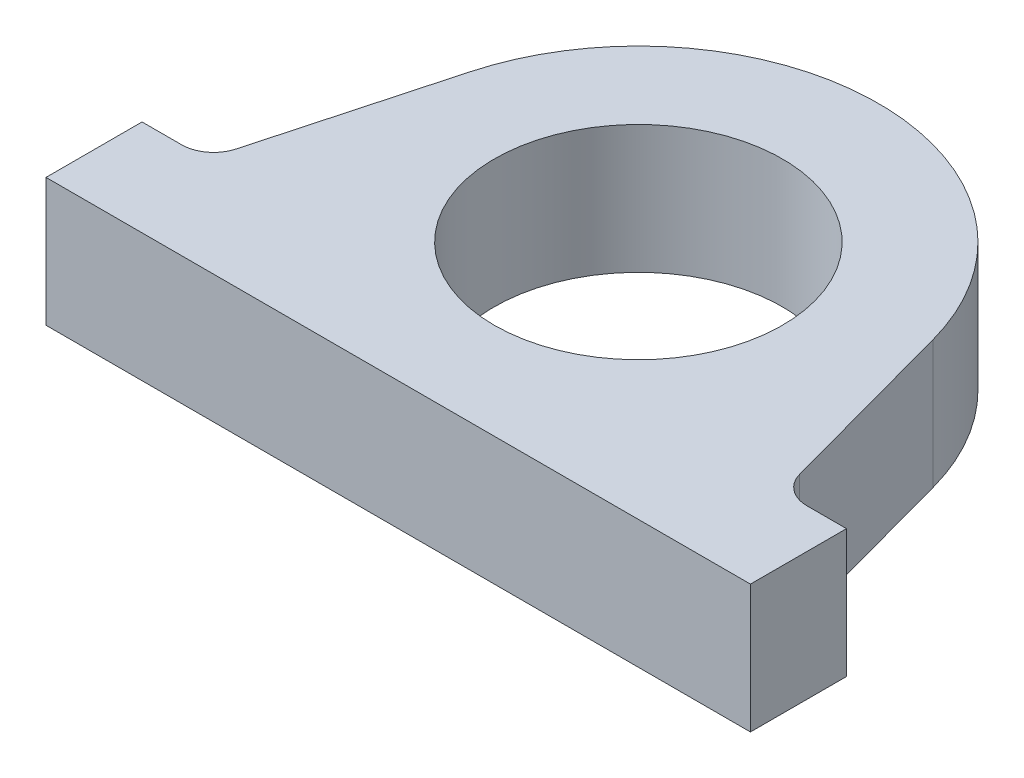
ISO-10303-21;
HEADER;
FILE_DESCRIPTION(('STEP AP214'),'2;1');
FILE_NAME('part.step','',(''),(''),'','','');
FILE_SCHEMA(('AUTOMOTIVE_DESIGN { 1 0 10303 214 1 1 1 1 }'));
ENDSEC;
DATA;
#1=APPLICATION_CONTEXT('core data for automotive mechanical design processes');
#2=APPLICATION_PROTOCOL_DEFINITION('international standard','automotive_design',2000,#1);
#3=PRODUCT_CONTEXT('',#1,'mechanical');
#4=PRODUCT('Part','Part','',(#3));
#5=PRODUCT_RELATED_PRODUCT_CATEGORY('part','',(#4));
#6=PRODUCT_DEFINITION_FORMATION('','',#4);
#7=PRODUCT_DEFINITION_CONTEXT('part definition',#1,'design');
#8=PRODUCT_DEFINITION('design','',#6,#7);
#9=PRODUCT_DEFINITION_SHAPE('','',#8);
#10=(LENGTH_UNIT() NAMED_UNIT(*) SI_UNIT(.MILLI.,.METRE.));
#11=(NAMED_UNIT(*) PLANE_ANGLE_UNIT() SI_UNIT($,.RADIAN.));
#12=(NAMED_UNIT(*) SI_UNIT($,.STERADIAN.) SOLID_ANGLE_UNIT());
#13=UNCERTAINTY_MEASURE_WITH_UNIT(LENGTH_MEASURE(1.E-05),#10,'distance_accuracy_value','');
#14=(GEOMETRIC_REPRESENTATION_CONTEXT(3) GLOBAL_UNCERTAINTY_ASSIGNED_CONTEXT((#13)) GLOBAL_UNIT_ASSIGNED_CONTEXT((#10,
#11,#12)) REPRESENTATION_CONTEXT('',''));
#15=CARTESIAN_POINT('',(0.,0.,0.));
#16=DIRECTION('',(0.,0.,1.));
#17=DIRECTION('',(1.,0.,0.));
#18=AXIS2_PLACEMENT_3D('',#15,#16,#17);
#19=CARTESIAN_POINT('',(0.,40.,-75.));
#20=DIRECTION('',(0.,-1.,0.));
#21=DIRECTION('',(0.,0.,-1.));
#22=AXIS2_PLACEMENT_3D('',#19,#20,#21);
#23=PLANE('',#22);
#24=DIRECTION('',(0.,0.,1.));
#25=VECTOR('',#24,1.);
#26=CARTESIAN_POINT('',(-110.,40.,0.));
#27=LINE('',#26,#25);
#28=CARTESIAN_POINT('',(-110.,40.,-30.));
#29=VERTEX_POINT('',#28);
#30=CARTESIAN_POINT('',(-110.,40.,0.));
#31=VERTEX_POINT('',#30);
#32=EDGE_CURVE('E131',#29,#31,#27,.T.);
#33=ORIENTED_EDGE('',*,*,#32,.T.);
#34=DIRECTION('',(1.,0.,0.));
#35=VECTOR('',#34,1.);
#36=CARTESIAN_POINT('',(110.,40.,0.));
#37=LINE('',#36,#35);
#38=CARTESIAN_POINT('',(110.,40.,0.));
#39=VERTEX_POINT('',#38);
#40=EDGE_CURVE('E120',#31,#39,#37,.T.);
#41=ORIENTED_EDGE('',*,*,#40,.T.);
#42=DIRECTION('',(0.,0.,-1.));
#43=VECTOR('',#42,1.);
#44=CARTESIAN_POINT('',(110.,40.,0.));
#45=LINE('',#44,#43);
#46=CARTESIAN_POINT('',(110.,40.,-30.));
#47=VERTEX_POINT('',#46);
#48=EDGE_CURVE('E130',#39,#47,#45,.T.);
#49=ORIENTED_EDGE('',*,*,#48,.T.);
#50=DIRECTION('',(-1.,0.,0.));
#51=VECTOR('',#50,1.);
#52=CARTESIAN_POINT('',(110.,40.,-30.));
#53=LINE('',#52,#51);
#54=CARTESIAN_POINT('',(97.6393202250021,40.,-30.));
#55=VERTEX_POINT('',#54);
#56=EDGE_CURVE('E201',#47,#55,#53,.T.);
#57=ORIENTED_EDGE('',*,*,#56,.T.);
#58=CARTESIAN_POINT('',(97.6393202250021,40.,-40.));
#59=DIRECTION('',(0.,-1.,0.));
#60=DIRECTION('',(0.,0.,-1.));
#61=AXIS2_PLACEMENT_3D('',#58,#59,#60);
#62=CIRCLE('',#61,10.);
#63=CARTESIAN_POINT('',(87.9912295883357,40.,-37.3704853933339));
#64=VERTEX_POINT('',#63);
#65=EDGE_CURVE('E11',#55,#64,#62,.T.);
#66=ORIENTED_EDGE('',*,*,#65,.T.);
#67=DIRECTION('',(-0.26295146066661,0.,-0.964809063666639));
#68=VECTOR('',#67,1.);
#69=CARTESIAN_POINT('',(90.,40.,-30.));
#70=LINE('',#69,#68);
#71=CARTESIAN_POINT('',(72.3606797749979,40.,-94.7213595499958));
#72=VERTEX_POINT('',#71);
#73=EDGE_CURVE('E215',#64,#72,#70,.T.);
#74=ORIENTED_EDGE('',*,*,#73,.T.);
#75=CARTESIAN_POINT('',(0.,40.,-75.));
#76=DIRECTION('',(0.,1.,0.));
#77=DIRECTION('',(0.,0.,-1.));
#78=AXIS2_PLACEMENT_3D('',#75,#76,#77);
#79=CIRCLE('',#78,75.);
#80=CARTESIAN_POINT('',(-72.3606797749979,40.,-94.7213595499957));
#81=VERTEX_POINT('',#80);
#82=EDGE_CURVE('E213',#72,#81,#79,.T.);
#83=ORIENTED_EDGE('',*,*,#82,.T.);
#84=DIRECTION('',(-0.26295146066661,0.,0.964809063666639));
#85=VECTOR('',#84,1.);
#86=CARTESIAN_POINT('',(-90.,40.,-30.));
#87=LINE('',#86,#85);
#88=CARTESIAN_POINT('',(-87.9912295883357,40.,-37.3704853933339));
#89=VERTEX_POINT('',#88);
#90=EDGE_CURVE('E165',#81,#89,#87,.T.);
#91=ORIENTED_EDGE('',*,*,#90,.T.);
#92=CARTESIAN_POINT('',(-97.6393202250021,40.,-40.));
#93=DIRECTION('',(0.,-1.,0.));
#94=DIRECTION('',(0.,0.,-1.));
#95=AXIS2_PLACEMENT_3D('',#92,#93,#94);
#96=CIRCLE('',#95,10.);
#97=CARTESIAN_POINT('',(-97.6393202250021,40.,-30.));
#98=VERTEX_POINT('',#97);
#99=EDGE_CURVE('E161',#89,#98,#96,.T.);
#100=ORIENTED_EDGE('',*,*,#99,.T.);
#101=DIRECTION('',(-1.,0.,0.));
#102=VECTOR('',#101,1.);
#103=CARTESIAN_POINT('',(-110.,40.,-30.));
#104=LINE('',#103,#102);
#105=EDGE_CURVE('E136',#98,#29,#104,.T.);
#106=ORIENTED_EDGE('',*,*,#105,.T.);
#107=EDGE_LOOP('',(#33,#41,#49,#57,#66,#74,#83,#91,#100,#106));
#108=FACE_BOUND('',#107,.T.);
#109=CARTESIAN_POINT('',(0.,40.,-75.));
#110=DIRECTION('',(0.,1.,0.));
#111=DIRECTION('',(0.,0.,1.));
#112=AXIS2_PLACEMENT_3D('',#109,#110,#111);
#113=CIRCLE('',#112,45.);
#114=CARTESIAN_POINT('',(0.,40.,-30.));
#115=VERTEX_POINT('',#114);
#116=EDGE_CURVE('E210',#115,#115,#113,.T.);
#117=ORIENTED_EDGE('',*,*,#116,.F.);
#118=EDGE_LOOP('',(#117));
#119=FACE_BOUND('',#118,.T.);
#120=ADVANCED_FACE('F43',(#108,#119),#23,.F.);
#121=CARTESIAN_POINT('',(0.,0.,-75.));
#122=DIRECTION('',(0.,-1.,0.));
#123=DIRECTION('',(0.,0.,-1.));
#124=AXIS2_PLACEMENT_3D('',#121,#122,#123);
#125=PLANE('',#124);
#126=DIRECTION('',(0.,0.,1.));
#127=VECTOR('',#126,1.);
#128=CARTESIAN_POINT('',(-110.,0.,0.));
#129=LINE('',#128,#127);
#130=CARTESIAN_POINT('',(-110.,0.,-30.));
#131=VERTEX_POINT('',#130);
#132=CARTESIAN_POINT('',(-110.,0.,0.));
#133=VERTEX_POINT('',#132);
#134=EDGE_CURVE('E144',#131,#133,#129,.T.);
#135=ORIENTED_EDGE('',*,*,#134,.F.);
#136=DIRECTION('',(-1.,0.,0.));
#137=VECTOR('',#136,1.);
#138=CARTESIAN_POINT('',(-110.,0.,-30.));
#139=LINE('',#138,#137);
#140=CARTESIAN_POINT('',(-97.6393202250021,0.,-30.));
#141=VERTEX_POINT('',#140);
#142=EDGE_CURVE('E140',#141,#131,#139,.T.);
#143=ORIENTED_EDGE('',*,*,#142,.F.);
#144=CARTESIAN_POINT('',(-97.6393202250021,0.,-40.));
#145=DIRECTION('',(0.,-1.,0.));
#146=DIRECTION('',(0.,0.,-1.));
#147=AXIS2_PLACEMENT_3D('',#144,#145,#146);
#148=CIRCLE('',#147,10.);
#149=CARTESIAN_POINT('',(-87.9912295883357,0.,-37.3704853933339));
#150=VERTEX_POINT('',#149);
#151=EDGE_CURVE('E159',#141,#150,#148,.F.);
#152=ORIENTED_EDGE('',*,*,#151,.T.);
#153=DIRECTION('',(-0.26295146066661,0.,0.964809063666639));
#154=VECTOR('',#153,1.);
#155=CARTESIAN_POINT('',(-90.,0.,-30.));
#156=LINE('',#155,#154);
#157=CARTESIAN_POINT('',(-72.3606797749979,0.,-94.7213595499957));
#158=VERTEX_POINT('',#157);
#159=EDGE_CURVE('E180',#158,#150,#156,.T.);
#160=ORIENTED_EDGE('',*,*,#159,.F.);
#161=CARTESIAN_POINT('',(0.,0.,-75.));
#162=DIRECTION('',(0.,1.,0.));
#163=DIRECTION('',(0.,0.,-1.));
#164=AXIS2_PLACEMENT_3D('',#161,#162,#163);
#165=CIRCLE('',#164,75.);
#166=CARTESIAN_POINT('',(72.3606797749979,0.,-94.7213595499958));
#167=VERTEX_POINT('',#166);
#168=EDGE_CURVE('E186',#167,#158,#165,.T.);
#169=ORIENTED_EDGE('',*,*,#168,.F.);
#170=DIRECTION('',(-0.26295146066661,0.,-0.964809063666639));
#171=VECTOR('',#170,1.);
#172=CARTESIAN_POINT('',(90.,0.,-30.));
#173=LINE('',#172,#171);
#174=CARTESIAN_POINT('',(87.9912295883357,0.,-37.3704853933339));
#175=VERTEX_POINT('',#174);
#176=EDGE_CURVE('E189',#175,#167,#173,.T.);
#177=ORIENTED_EDGE('',*,*,#176,.F.);
#178=CARTESIAN_POINT('',(97.6393202250021,0.,-40.));
#179=DIRECTION('',(0.,-1.,0.));
#180=DIRECTION('',(0.,0.,-1.));
#181=AXIS2_PLACEMENT_3D('',#178,#179,#180);
#182=CIRCLE('',#181,10.);
#183=CARTESIAN_POINT('',(97.6393202250021,0.,-30.));
#184=VERTEX_POINT('',#183);
#185=EDGE_CURVE('E51',#175,#184,#182,.F.);
#186=ORIENTED_EDGE('',*,*,#185,.T.);
#187=DIRECTION('',(-1.,0.,0.));
#188=VECTOR('',#187,1.);
#189=CARTESIAN_POINT('',(110.,0.,-30.));
#190=LINE('',#189,#188);
#191=CARTESIAN_POINT('',(110.,0.,-30.));
#192=VERTEX_POINT('',#191);
#193=EDGE_CURVE('E200',#192,#184,#190,.T.);
#194=ORIENTED_EDGE('',*,*,#193,.F.);
#195=DIRECTION('',(0.,0.,-1.));
#196=VECTOR('',#195,1.);
#197=CARTESIAN_POINT('',(110.,0.,0.));
#198=LINE('',#197,#196);
#199=CARTESIAN_POINT('',(110.,0.,0.));
#200=VERTEX_POINT('',#199);
#201=EDGE_CURVE('E204',#200,#192,#198,.T.);
#202=ORIENTED_EDGE('',*,*,#201,.F.);
#203=DIRECTION('',(1.,0.,0.));
#204=VECTOR('',#203,1.);
#205=CARTESIAN_POINT('',(110.,0.,0.));
#206=LINE('',#205,#204);
#207=EDGE_CURVE('E206',#133,#200,#206,.T.);
#208=ORIENTED_EDGE('',*,*,#207,.F.);
#209=EDGE_LOOP('',(#135,#143,#152,#160,#169,#177,#186,#194,#202,#208));
#210=FACE_BOUND('',#209,.T.);
#211=CARTESIAN_POINT('',(0.,0.,-75.));
#212=DIRECTION('',(0.,1.,0.));
#213=DIRECTION('',(0.,0.,1.));
#214=AXIS2_PLACEMENT_3D('',#211,#212,#213);
#215=CIRCLE('',#214,45.);
#216=CARTESIAN_POINT('',(0.,0.,-30.));
#217=VERTEX_POINT('',#216);
#218=EDGE_CURVE('E219',#217,#217,#215,.T.);
#219=ORIENTED_EDGE('',*,*,#218,.T.);
#220=EDGE_LOOP('',(#219));
#221=FACE_BOUND('',#220,.T.);
#222=ADVANCED_FACE('F177',(#210,#221),#125,.T.);
#223=CARTESIAN_POINT('',(-110.,40.,0.));
#224=DIRECTION('',(1.,0.,0.));
#225=DIRECTION('',(0.,0.,-1.));
#226=AXIS2_PLACEMENT_3D('',#223,#224,#225);
#227=PLANE('',#226);
#228=ORIENTED_EDGE('',*,*,#134,.T.);
#229=DIRECTION('',(0.,-1.,0.));
#230=VECTOR('',#229,1.);
#231=CARTESIAN_POINT('',(-110.,40.,0.));
#232=LINE('',#231,#230);
#233=EDGE_CURVE('E124',#31,#133,#232,.T.);
#234=ORIENTED_EDGE('',*,*,#233,.F.);
#235=ORIENTED_EDGE('',*,*,#32,.F.);
#236=DIRECTION('',(0.,-1.,0.));
#237=VECTOR('',#236,1.);
#238=CARTESIAN_POINT('',(-110.,40.,-30.));
#239=LINE('',#238,#237);
#240=EDGE_CURVE('E172',#29,#131,#239,.T.);
#241=ORIENTED_EDGE('',*,*,#240,.T.);
#242=EDGE_LOOP('',(#228,#234,#235,#241));
#243=FACE_BOUND('',#242,.T.);
#244=ADVANCED_FACE('F142',(#243),#227,.F.);
#245=CARTESIAN_POINT('',(110.,40.,0.));
#246=DIRECTION('',(0.,0.,-1.));
#247=DIRECTION('',(-1.,0.,0.));
#248=AXIS2_PLACEMENT_3D('',#245,#246,#247);
#249=PLANE('',#248);
#250=ORIENTED_EDGE('',*,*,#207,.T.);
#251=DIRECTION('',(0.,-1.,0.));
#252=VECTOR('',#251,1.);
#253=CARTESIAN_POINT('',(110.,40.,0.));
#254=LINE('',#253,#252);
#255=EDGE_CURVE('E127',#39,#200,#254,.T.);
#256=ORIENTED_EDGE('',*,*,#255,.F.);
#257=ORIENTED_EDGE('',*,*,#40,.F.);
#258=ORIENTED_EDGE('',*,*,#233,.T.);
#259=EDGE_LOOP('',(#250,#256,#257,#258));
#260=FACE_BOUND('',#259,.T.);
#261=ADVANCED_FACE('F122',(#260),#249,.F.);
#262=CARTESIAN_POINT('',(110.,40.,0.));
#263=DIRECTION('',(-1.,0.,0.));
#264=DIRECTION('',(0.,0.,1.));
#265=AXIS2_PLACEMENT_3D('',#262,#263,#264);
#266=PLANE('',#265);
#267=ORIENTED_EDGE('',*,*,#201,.T.);
#268=DIRECTION('',(0.,-1.,0.));
#269=VECTOR('',#268,1.);
#270=CARTESIAN_POINT('',(110.,40.,-30.));
#271=LINE('',#270,#269);
#272=EDGE_CURVE('E150',#47,#192,#271,.T.);
#273=ORIENTED_EDGE('',*,*,#272,.F.);
#274=ORIENTED_EDGE('',*,*,#48,.F.);
#275=ORIENTED_EDGE('',*,*,#255,.T.);
#276=EDGE_LOOP('',(#267,#273,#274,#275));
#277=FACE_BOUND('',#276,.T.);
#278=ADVANCED_FACE('F249',(#277),#266,.F.);
#279=CARTESIAN_POINT('',(110.,40.,-30.));
#280=DIRECTION('',(0.,0.,1.));
#281=DIRECTION('',(1.,0.,0.));
#282=AXIS2_PLACEMENT_3D('',#279,#280,#281);
#283=PLANE('',#282);
#284=ORIENTED_EDGE('',*,*,#193,.T.);
#285=DIRECTION('',(0.,-1.,0.));
#286=VECTOR('',#285,1.);
#287=CARTESIAN_POINT('',(97.6393202250021,40.,-30.));
#288=LINE('',#287,#286);
#289=EDGE_CURVE('E58',#184,#55,#288,.F.);
#290=ORIENTED_EDGE('',*,*,#289,.T.);
#291=ORIENTED_EDGE('',*,*,#56,.F.);
#292=ORIENTED_EDGE('',*,*,#272,.T.);
#293=EDGE_LOOP('',(#284,#290,#291,#292));
#294=FACE_BOUND('',#293,.T.);
#295=ADVANCED_FACE('F199',(#294),#283,.F.);
#296=CARTESIAN_POINT('',(90.,40.,-30.));
#297=DIRECTION('',(-0.964809063666639,0.,0.26295146066661));
#298=DIRECTION('',(0.26295146066661,0.,0.964809063666639));
#299=AXIS2_PLACEMENT_3D('',#296,#297,#298);
#300=PLANE('',#299);
#301=ORIENTED_EDGE('',*,*,#73,.F.);
#302=DIRECTION('',(0.,-1.,0.));
#303=VECTOR('',#302,1.);
#304=CARTESIAN_POINT('',(87.9912295883357,0.,-37.3704853933339));
#305=LINE('',#304,#303);
#306=EDGE_CURVE('E155',#64,#175,#305,.T.);
#307=ORIENTED_EDGE('',*,*,#306,.T.);
#308=ORIENTED_EDGE('',*,*,#176,.T.);
#309=DIRECTION('',(0.,-1.,0.));
#310=VECTOR('',#309,1.);
#311=CARTESIAN_POINT('',(72.3606797749979,40.,-94.7213595499958));
#312=LINE('',#311,#310);
#313=EDGE_CURVE('E195',#72,#167,#312,.T.);
#314=ORIENTED_EDGE('',*,*,#313,.F.);
#315=EDGE_LOOP('',(#301,#307,#308,#314));
#316=FACE_BOUND('',#315,.T.);
#317=ADVANCED_FACE('F242',(#316),#300,.F.);
#318=CARTESIAN_POINT('',(0.,40.,-75.));
#319=DIRECTION('',(0.,-1.,0.));
#320=DIRECTION('',(0.,0.,-1.));
#321=AXIS2_PLACEMENT_3D('',#318,#319,#320);
#322=CYLINDRICAL_SURFACE('',#321,75.);
#323=ORIENTED_EDGE('',*,*,#168,.T.);
#324=DIRECTION('',(0.,-1.,0.));
#325=VECTOR('',#324,1.);
#326=CARTESIAN_POINT('',(-72.3606797749979,40.,-94.7213595499957));
#327=LINE('',#326,#325);
#328=EDGE_CURVE('E185',#81,#158,#327,.T.);
#329=ORIENTED_EDGE('',*,*,#328,.F.);
#330=ORIENTED_EDGE('',*,*,#82,.F.);
#331=ORIENTED_EDGE('',*,*,#313,.T.);
#332=EDGE_LOOP('',(#323,#329,#330,#331));
#333=FACE_BOUND('',#332,.T.);
#334=ADVANCED_FACE('F239',(#333),#322,.T.);
#335=CARTESIAN_POINT('',(-90.,40.,-30.));
#336=DIRECTION('',(0.964809063666639,0.,0.26295146066661));
#337=DIRECTION('',(0.26295146066661,0.,-0.964809063666639));
#338=AXIS2_PLACEMENT_3D('',#335,#336,#337);
#339=PLANE('',#338);
#340=ORIENTED_EDGE('',*,*,#159,.T.);
#341=DIRECTION('',(0.,-1.,0.));
#342=VECTOR('',#341,1.);
#343=CARTESIAN_POINT('',(-87.9912295883357,40.,-37.3704853933339));
#344=LINE('',#343,#342);
#345=EDGE_CURVE('E148',#150,#89,#344,.F.);
#346=ORIENTED_EDGE('',*,*,#345,.T.);
#347=ORIENTED_EDGE('',*,*,#90,.F.);
#348=ORIENTED_EDGE('',*,*,#328,.T.);
#349=EDGE_LOOP('',(#340,#346,#347,#348));
#350=FACE_BOUND('',#349,.T.);
#351=ADVANCED_FACE('F183',(#350),#339,.F.);
#352=CARTESIAN_POINT('',(-110.,40.,-30.));
#353=DIRECTION('',(0.,0.,1.));
#354=DIRECTION('',(1.,0.,0.));
#355=AXIS2_PLACEMENT_3D('',#352,#353,#354);
#356=PLANE('',#355);
#357=ORIENTED_EDGE('',*,*,#105,.F.);
#358=DIRECTION('',(0.,-1.,0.));
#359=VECTOR('',#358,1.);
#360=CARTESIAN_POINT('',(-97.6393202250021,0.,-30.));
#361=LINE('',#360,#359);
#362=EDGE_CURVE('E145',#98,#141,#361,.T.);
#363=ORIENTED_EDGE('',*,*,#362,.T.);
#364=ORIENTED_EDGE('',*,*,#142,.T.);
#365=ORIENTED_EDGE('',*,*,#240,.F.);
#366=EDGE_LOOP('',(#357,#363,#364,#365));
#367=FACE_BOUND('',#366,.T.);
#368=ADVANCED_FACE('F170',(#367),#356,.F.);
#369=CARTESIAN_POINT('',(0.,40.,-75.));
#370=DIRECTION('',(0.,-1.,0.));
#371=DIRECTION('',(0.,0.,-1.));
#372=AXIS2_PLACEMENT_3D('',#369,#370,#371);
#373=CYLINDRICAL_SURFACE('',#372,45.);
#374=ORIENTED_EDGE('',*,*,#116,.T.);
#375=EDGE_LOOP('',(#374));
#376=FACE_BOUND('',#375,.T.);
#377=ORIENTED_EDGE('',*,*,#218,.F.);
#378=EDGE_LOOP('',(#377));
#379=FACE_BOUND('',#378,.T.);
#380=ADVANCED_FACE('F225',(#376,#379),#373,.F.);
#381=CARTESIAN_POINT('',(-97.6393202250021,40.,-40.));
#382=DIRECTION('',(0.,1.,0.));
#383=DIRECTION('',(0.,0.,1.));
#384=AXIS2_PLACEMENT_3D('',#381,#382,#383);
#385=CYLINDRICAL_SURFACE('',#384,10.);
#386=ORIENTED_EDGE('',*,*,#99,.F.);
#387=ORIENTED_EDGE('',*,*,#345,.F.);
#388=ORIENTED_EDGE('',*,*,#151,.F.);
#389=ORIENTED_EDGE('',*,*,#362,.F.);
#390=EDGE_LOOP('',(#386,#387,#388,#389));
#391=FACE_BOUND('',#390,.T.);
#392=ADVANCED_FACE('F174',(#391),#385,.F.);
#393=CARTESIAN_POINT('',(97.6393202250021,40.,-40.));
#394=DIRECTION('',(0.,1.,0.));
#395=DIRECTION('',(0.,0.,1.));
#396=AXIS2_PLACEMENT_3D('',#393,#394,#395);
#397=CYLINDRICAL_SURFACE('',#396,10.);
#398=ORIENTED_EDGE('',*,*,#65,.F.);
#399=ORIENTED_EDGE('',*,*,#289,.F.);
#400=ORIENTED_EDGE('',*,*,#185,.F.);
#401=ORIENTED_EDGE('',*,*,#306,.F.);
#402=EDGE_LOOP('',(#398,#399,#400,#401));
#403=FACE_BOUND('',#402,.T.);
#404=ADVANCED_FACE('F45',(#403),#397,.F.);
#405=CLOSED_SHELL('',(#120,#222,#244,#261,#278,#295,#317,#334,#351,#368,#380,#392,#404));
#406=MANIFOLD_SOLID_BREP('B2',#405);
#407=ADVANCED_BREP_SHAPE_REPRESENTATION('',(#18,#406),#14);
#408=SHAPE_DEFINITION_REPRESENTATION(#9,#407);
ENDSEC;
END-ISO-10303-21;
